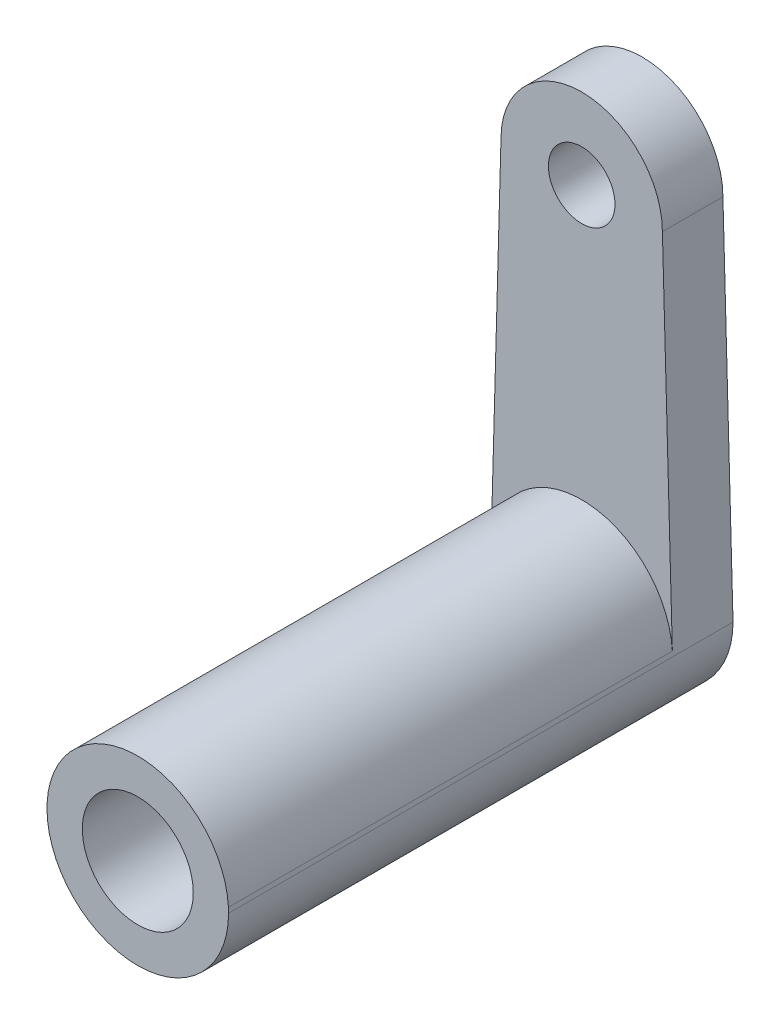
ISO-10303-21;
HEADER;
FILE_DESCRIPTION(('STEP AP214'),'2;1');
FILE_NAME('part.step','',(''),(''),'','','');
FILE_SCHEMA(('AUTOMOTIVE_DESIGN { 1 0 10303 214 1 1 1 1 }'));
ENDSEC;
DATA;
#1=APPLICATION_CONTEXT('core data for automotive mechanical design processes');
#2=APPLICATION_PROTOCOL_DEFINITION('international standard','automotive_design',2000,#1);
#3=PRODUCT_CONTEXT('',#1,'mechanical');
#4=PRODUCT('Part','Part','',(#3));
#5=PRODUCT_RELATED_PRODUCT_CATEGORY('part','',(#4));
#6=PRODUCT_DEFINITION_FORMATION('','',#4);
#7=PRODUCT_DEFINITION_CONTEXT('part definition',#1,'design');
#8=PRODUCT_DEFINITION('design','',#6,#7);
#9=PRODUCT_DEFINITION_SHAPE('','',#8);
#10=(LENGTH_UNIT() NAMED_UNIT(*) SI_UNIT(.MILLI.,.METRE.));
#11=(NAMED_UNIT(*) PLANE_ANGLE_UNIT() SI_UNIT($,.RADIAN.));
#12=(NAMED_UNIT(*) SI_UNIT($,.STERADIAN.) SOLID_ANGLE_UNIT());
#13=UNCERTAINTY_MEASURE_WITH_UNIT(LENGTH_MEASURE(1.E-05),#10,'distance_accuracy_value','');
#14=(GEOMETRIC_REPRESENTATION_CONTEXT(3) GLOBAL_UNCERTAINTY_ASSIGNED_CONTEXT((#13)) GLOBAL_UNIT_ASSIGNED_CONTEXT((#10,
#11,#12)) REPRESENTATION_CONTEXT('',''));
#15=CARTESIAN_POINT('',(0.,0.,0.));
#16=DIRECTION('',(0.,0.,1.));
#17=DIRECTION('',(1.,0.,0.));
#18=AXIS2_PLACEMENT_3D('',#15,#16,#17);
#19=CARTESIAN_POINT('',(0.,2.,3.));
#20=DIRECTION('',(0.,1.,0.));
#21=DIRECTION('',(0.,0.,1.));
#22=AXIS2_PLACEMENT_3D('',#19,#20,#21);
#23=PLANE('',#22);
#24=DIRECTION('',(1.,0.,0.));
#25=VECTOR('',#24,1.);
#26=CARTESIAN_POINT('',(0.,2.,15.));
#27=LINE('',#26,#25);
#28=CARTESIAN_POINT('',(-1.88745860881769,2.,15.));
#29=VERTEX_POINT('',#28);
#30=CARTESIAN_POINT('',(1.88745860881769,2.,15.));
#31=VERTEX_POINT('',#30);
#32=EDGE_CURVE('E11',#29,#31,#27,.T.);
#33=ORIENTED_EDGE('',*,*,#32,.F.);
#34=DIRECTION('',(0.,0.,-1.));
#35=VECTOR('',#34,1.);
#36=CARTESIAN_POINT('',(-1.88745860881769,2.,3.));
#37=LINE('',#36,#35);
#38=CARTESIAN_POINT('',(-1.88745860881769,2.,0.));
#39=VERTEX_POINT('',#38);
#40=EDGE_CURVE('E92',#29,#39,#37,.T.);
#41=ORIENTED_EDGE('',*,*,#40,.T.);
#42=DIRECTION('',(1.,0.,0.));
#43=VECTOR('',#42,1.);
#44=CARTESIAN_POINT('',(0.,2.,0.));
#45=LINE('',#44,#43);
#46=CARTESIAN_POINT('',(1.88745860881769,2.,0.));
#47=VERTEX_POINT('',#46);
#48=EDGE_CURVE('E125',#39,#47,#45,.T.);
#49=ORIENTED_EDGE('',*,*,#48,.T.);
#50=DIRECTION('',(0.,0.,-1.));
#51=VECTOR('',#50,1.);
#52=CARTESIAN_POINT('',(1.88745860881769,2.,3.));
#53=LINE('',#52,#51);
#54=EDGE_CURVE('E117',#31,#47,#53,.T.);
#55=ORIENTED_EDGE('',*,*,#54,.F.);
#56=EDGE_LOOP('',(#33,#41,#49,#55));
#57=FACE_BOUND('',#56,.T.);
#58=ADVANCED_FACE('F41',(#57),#23,.F.);
#59=CARTESIAN_POINT('',(0.,0.,3.));
#60=DIRECTION('',(0.,0.,1.));
#61=DIRECTION('',(1.,0.,0.));
#62=AXIS2_PLACEMENT_3D('',#59,#60,#61);
#63=PLANE('',#62);
#64=CARTESIAN_POINT('',(0.,18.,3.));
#65=DIRECTION('',(0.,0.,1.));
#66=DIRECTION('',(1.,0.,0.));
#67=AXIS2_PLACEMENT_3D('',#64,#65,#66);
#68=CIRCLE('',#67,1.65);
#69=CARTESIAN_POINT('',(1.65,18.,3.));
#70=VERTEX_POINT('',#69);
#71=EDGE_CURVE('E104',#70,#70,#68,.T.);
#72=ORIENTED_EDGE('',*,*,#71,.F.);
#73=EDGE_LOOP('',(#72));
#74=FACE_BOUND('',#73,.T.);
#75=DIRECTION('',(-0.0277670672403533,-0.999614420652718,0.));
#76=VECTOR('',#75,1.);
#77=CARTESIAN_POINT('',(-4.49653045489591,0.124903623747109,3.));
#78=LINE('',#77,#76);
#79=CARTESIAN_POINT('',(-4.,18.,3.));
#80=VERTEX_POINT('',#79);
#81=CARTESIAN_POINT('',(-4.49306090979183,0.249807247494222,3.));
#82=VERTEX_POINT('',#81);
#83=EDGE_CURVE('E196',#80,#82,#78,.T.);
#84=ORIENTED_EDGE('',*,*,#83,.T.);
#85=CARTESIAN_POINT('',(0.,0.,3.));
#86=DIRECTION('',(0.,0.,1.));
#87=DIRECTION('',(1.,0.,0.));
#88=AXIS2_PLACEMENT_3D('',#85,#86,#87);
#89=CIRCLE('',#88,4.5);
#90=CARTESIAN_POINT('',(4.49306090979183,0.249807247494222,3.));
#91=VERTEX_POINT('',#90);
#92=EDGE_CURVE('E135',#82,#91,#89,.F.);
#93=ORIENTED_EDGE('',*,*,#92,.T.);
#94=DIRECTION('',(0.0277670672403533,-0.999614420652718,0.));
#95=VECTOR('',#94,1.);
#96=CARTESIAN_POINT('',(4.49653045489591,0.124903623747109,3.));
#97=LINE('',#96,#95);
#98=CARTESIAN_POINT('',(4.,18.,3.));
#99=VERTEX_POINT('',#98);
#100=EDGE_CURVE('E118',#99,#91,#97,.T.);
#101=ORIENTED_EDGE('',*,*,#100,.F.);
#102=CARTESIAN_POINT('',(0.,18.,3.));
#103=DIRECTION('',(0.,0.,1.));
#104=DIRECTION('',(1.,0.,0.));
#105=AXIS2_PLACEMENT_3D('',#102,#103,#104);
#106=CIRCLE('',#105,4.);
#107=EDGE_CURVE('E89',#99,#80,#106,.T.);
#108=ORIENTED_EDGE('',*,*,#107,.T.);
#109=EDGE_LOOP('',(#84,#93,#101,#108));
#110=FACE_BOUND('',#109,.T.);
#111=ADVANCED_FACE('F198',(#74,#110),#63,.T.);
#112=CARTESIAN_POINT('',(0.,18.,3.));
#113=DIRECTION('',(0.,0.,-1.));
#114=DIRECTION('',(-1.,0.,0.));
#115=AXIS2_PLACEMENT_3D('',#112,#113,#114);
#116=CYLINDRICAL_SURFACE('',#115,4.);
#117=CARTESIAN_POINT('',(0.,18.,0.));
#118=DIRECTION('',(0.,0.,1.));
#119=DIRECTION('',(1.,0.,0.));
#120=AXIS2_PLACEMENT_3D('',#117,#118,#119);
#121=CIRCLE('',#120,4.);
#122=CARTESIAN_POINT('',(4.,18.,0.));
#123=VERTEX_POINT('',#122);
#124=CARTESIAN_POINT('',(-4.,18.,0.));
#125=VERTEX_POINT('',#124);
#126=EDGE_CURVE('E87',#123,#125,#121,.T.);
#127=ORIENTED_EDGE('',*,*,#126,.T.);
#128=DIRECTION('',(0.,0.,-1.));
#129=VECTOR('',#128,1.);
#130=CARTESIAN_POINT('',(-4.,18.,3.));
#131=LINE('',#130,#129);
#132=EDGE_CURVE('E50',#80,#125,#131,.T.);
#133=ORIENTED_EDGE('',*,*,#132,.F.);
#134=ORIENTED_EDGE('',*,*,#107,.F.);
#135=DIRECTION('',(0.,0.,-1.));
#136=VECTOR('',#135,1.);
#137=CARTESIAN_POINT('',(4.,18.,3.));
#138=LINE('',#137,#136);
#139=EDGE_CURVE('E58',#99,#123,#138,.T.);
#140=ORIENTED_EDGE('',*,*,#139,.T.);
#141=EDGE_LOOP('',(#127,#133,#134,#140));
#142=FACE_BOUND('',#141,.T.);
#143=ADVANCED_FACE('F85',(#142),#116,.T.);
#144=CARTESIAN_POINT('',(-4.49653045489591,0.124903623747109,3.));
#145=DIRECTION('',(0.999614420652718,-0.0277670672403533,0.));
#146=DIRECTION('',(0.0277670672403533,0.999614420652718,0.));
#147=AXIS2_PLACEMENT_3D('',#144,#145,#146);
#148=PLANE('',#147);
#149=DIRECTION('',(0.,0.,-1.));
#150=VECTOR('',#149,1.);
#151=CARTESIAN_POINT('',(-4.5,0.,3.));
#152=LINE('',#151,#150);
#153=CARTESIAN_POINT('',(-4.5,0.,25.));
#154=VERTEX_POINT('',#153);
#155=CARTESIAN_POINT('',(-4.5,0.,0.));
#156=VERTEX_POINT('',#155);
#157=EDGE_CURVE('E113',#154,#156,#152,.T.);
#158=ORIENTED_EDGE('',*,*,#157,.F.);
#159=DIRECTION('',(-0.0277670672403533,-0.999614420652718,0.));
#160=VECTOR('',#159,1.);
#161=CARTESIAN_POINT('',(-4.49653045489591,0.124903623747109,25.));
#162=LINE('',#161,#160);
#163=CARTESIAN_POINT('',(-4.49306090979183,0.249807247494222,25.));
#164=VERTEX_POINT('',#163);
#165=EDGE_CURVE('E161',#164,#154,#162,.T.);
#166=ORIENTED_EDGE('',*,*,#165,.F.);
#167=DIRECTION('',(0.,0.,-1.));
#168=VECTOR('',#167,1.);
#169=CARTESIAN_POINT('',(-4.49306090979183,0.249807247494222,25.));
#170=LINE('',#169,#168);
#171=EDGE_CURVE('E138',#164,#82,#170,.T.);
#172=ORIENTED_EDGE('',*,*,#171,.T.);
#173=ORIENTED_EDGE('',*,*,#83,.F.);
#174=ORIENTED_EDGE('',*,*,#132,.T.);
#175=DIRECTION('',(-0.0277670672403533,-0.999614420652718,0.));
#176=VECTOR('',#175,1.);
#177=CARTESIAN_POINT('',(-4.49653045489591,0.124903623747109,0.));
#178=LINE('',#177,#176);
#179=EDGE_CURVE('E96',#125,#156,#178,.T.);
#180=ORIENTED_EDGE('',*,*,#179,.T.);
#181=EDGE_LOOP('',(#158,#166,#172,#173,#174,#180));
#182=FACE_BOUND('',#181,.T.);
#183=ADVANCED_FACE('F146',(#182),#148,.F.);
#184=CARTESIAN_POINT('',(0.,0.,3.));
#185=DIRECTION('',(0.,0.,-1.));
#186=DIRECTION('',(-1.,0.,0.));
#187=AXIS2_PLACEMENT_3D('',#184,#185,#186);
#188=CYLINDRICAL_SURFACE('',#187,4.5);
#189=CARTESIAN_POINT('',(0.,0.,0.));
#190=DIRECTION('',(0.,0.,1.));
#191=DIRECTION('',(1.,0.,0.));
#192=AXIS2_PLACEMENT_3D('',#189,#190,#191);
#193=CIRCLE('',#192,4.5);
#194=CARTESIAN_POINT('',(4.5,0.,0.));
#195=VERTEX_POINT('',#194);
#196=EDGE_CURVE('E105',#156,#195,#193,.T.);
#197=ORIENTED_EDGE('',*,*,#196,.T.);
#198=DIRECTION('',(0.,0.,-1.));
#199=VECTOR('',#198,1.);
#200=CARTESIAN_POINT('',(4.5,0.,3.));
#201=LINE('',#200,#199);
#202=CARTESIAN_POINT('',(4.5,0.,25.));
#203=VERTEX_POINT('',#202);
#204=EDGE_CURVE('E91',#203,#195,#201,.T.);
#205=ORIENTED_EDGE('',*,*,#204,.F.);
#206=CARTESIAN_POINT('',(0.,0.,25.));
#207=DIRECTION('',(0.,0.,1.));
#208=DIRECTION('',(1.,0.,0.));
#209=AXIS2_PLACEMENT_3D('',#206,#207,#208);
#210=CIRCLE('',#209,4.5);
#211=EDGE_CURVE('E154',#154,#203,#210,.T.);
#212=ORIENTED_EDGE('',*,*,#211,.F.);
#213=ORIENTED_EDGE('',*,*,#157,.T.);
#214=EDGE_LOOP('',(#197,#205,#212,#213));
#215=FACE_BOUND('',#214,.T.);
#216=ADVANCED_FACE('F152',(#215),#188,.T.);
#217=CARTESIAN_POINT('',(0.,0.,3.));
#218=DIRECTION('',(0.,0.,-1.));
#219=DIRECTION('',(-1.,0.,0.));
#220=AXIS2_PLACEMENT_3D('',#217,#218,#219);
#221=CYLINDRICAL_SURFACE('',#220,2.75);
#222=CARTESIAN_POINT('',(0.,0.,15.));
#223=DIRECTION('',(0.,0.,1.));
#224=DIRECTION('',(1.,0.,0.));
#225=AXIS2_PLACEMENT_3D('',#222,#223,#224);
#226=CIRCLE('',#225,2.75);
#227=EDGE_CURVE('E173',#31,#29,#226,.T.);
#228=ORIENTED_EDGE('',*,*,#227,.F.);
#229=ORIENTED_EDGE('',*,*,#54,.T.);
#230=CARTESIAN_POINT('',(0.,0.,0.));
#231=DIRECTION('',(0.,0.,1.));
#232=DIRECTION('',(1.,0.,0.));
#233=AXIS2_PLACEMENT_3D('',#230,#231,#232);
#234=CIRCLE('',#233,2.75);
#235=EDGE_CURVE('E132',#39,#47,#234,.T.);
#236=ORIENTED_EDGE('',*,*,#235,.F.);
#237=ORIENTED_EDGE('',*,*,#40,.F.);
#238=EDGE_LOOP('',(#228,#229,#236,#237));
#239=FACE_BOUND('',#238,.T.);
#240=CARTESIAN_POINT('',(0.,0.,25.));
#241=DIRECTION('',(0.,0.,1.));
#242=DIRECTION('',(1.,0.,0.));
#243=AXIS2_PLACEMENT_3D('',#240,#241,#242);
#244=CIRCLE('',#243,2.75);
#245=CARTESIAN_POINT('',(2.75,0.,25.));
#246=VERTEX_POINT('',#245);
#247=EDGE_CURVE('E169',#246,#246,#244,.T.);
#248=ORIENTED_EDGE('',*,*,#247,.T.);
#249=EDGE_LOOP('',(#248));
#250=FACE_BOUND('',#249,.T.);
#251=ADVANCED_FACE('F43',(#239,#250),#221,.F.);
#252=CARTESIAN_POINT('',(0.,18.,3.));
#253=DIRECTION('',(0.,0.,-1.));
#254=DIRECTION('',(-1.,0.,0.));
#255=AXIS2_PLACEMENT_3D('',#252,#253,#254);
#256=CYLINDRICAL_SURFACE('',#255,1.65);
#257=ORIENTED_EDGE('',*,*,#71,.T.);
#258=EDGE_LOOP('',(#257));
#259=FACE_BOUND('',#258,.T.);
#260=CARTESIAN_POINT('',(0.,18.,0.));
#261=DIRECTION('',(0.,0.,1.));
#262=DIRECTION('',(1.,0.,0.));
#263=AXIS2_PLACEMENT_3D('',#260,#261,#262);
#264=CIRCLE('',#263,1.65);
#265=CARTESIAN_POINT('',(1.65,18.,0.));
#266=VERTEX_POINT('',#265);
#267=EDGE_CURVE('E98',#266,#266,#264,.T.);
#268=ORIENTED_EDGE('',*,*,#267,.F.);
#269=EDGE_LOOP('',(#268));
#270=FACE_BOUND('',#269,.T.);
#271=ADVANCED_FACE('F219',(#259,#270),#256,.F.);
#272=CARTESIAN_POINT('',(4.49653045489591,0.124903623747109,3.));
#273=DIRECTION('',(0.999614420652718,0.0277670672403533,0.));
#274=DIRECTION('',(-0.0277670672403533,0.999614420652718,0.));
#275=AXIS2_PLACEMENT_3D('',#272,#273,#274);
#276=PLANE('',#275);
#277=ORIENTED_EDGE('',*,*,#204,.T.);
#278=DIRECTION('',(0.0277670672403533,-0.999614420652718,0.));
#279=VECTOR('',#278,1.);
#280=CARTESIAN_POINT('',(4.49653045489591,0.124903623747109,0.));
#281=LINE('',#280,#279);
#282=EDGE_CURVE('E81',#123,#195,#281,.T.);
#283=ORIENTED_EDGE('',*,*,#282,.F.);
#284=ORIENTED_EDGE('',*,*,#139,.F.);
#285=ORIENTED_EDGE('',*,*,#100,.T.);
#286=DIRECTION('',(0.,0.,-1.));
#287=VECTOR('',#286,1.);
#288=CARTESIAN_POINT('',(4.49306090979183,0.249807247494222,25.));
#289=LINE('',#288,#287);
#290=CARTESIAN_POINT('',(4.49306090979183,0.249807247494222,25.));
#291=VERTEX_POINT('',#290);
#292=EDGE_CURVE('E164',#291,#91,#289,.T.);
#293=ORIENTED_EDGE('',*,*,#292,.F.);
#294=DIRECTION('',(0.0277670672403533,-0.999614420652718,0.));
#295=VECTOR('',#294,1.);
#296=CARTESIAN_POINT('',(4.49653045489591,0.124903623747109,25.));
#297=LINE('',#296,#295);
#298=EDGE_CURVE('E160',#291,#203,#297,.T.);
#299=ORIENTED_EDGE('',*,*,#298,.T.);
#300=EDGE_LOOP('',(#277,#283,#284,#285,#293,#299));
#301=FACE_BOUND('',#300,.T.);
#302=ADVANCED_FACE('F100',(#301),#276,.T.);
#303=CARTESIAN_POINT('',(0.,0.,0.));
#304=DIRECTION('',(0.,0.,1.));
#305=DIRECTION('',(1.,0.,0.));
#306=AXIS2_PLACEMENT_3D('',#303,#304,#305);
#307=PLANE('',#306);
#308=ORIENTED_EDGE('',*,*,#235,.T.);
#309=ORIENTED_EDGE('',*,*,#48,.F.);
#310=EDGE_LOOP('',(#308,#309));
#311=FACE_BOUND('',#310,.T.);
#312=ORIENTED_EDGE('',*,*,#196,.F.);
#313=ORIENTED_EDGE('',*,*,#179,.F.);
#314=ORIENTED_EDGE('',*,*,#126,.F.);
#315=ORIENTED_EDGE('',*,*,#282,.T.);
#316=EDGE_LOOP('',(#312,#313,#314,#315));
#317=FACE_BOUND('',#316,.T.);
#318=ORIENTED_EDGE('',*,*,#267,.T.);
#319=EDGE_LOOP('',(#318));
#320=FACE_BOUND('',#319,.T.);
#321=ADVANCED_FACE('F94',(#311,#317,#320),#307,.F.);
#322=CARTESIAN_POINT('',(0.,0.,25.));
#323=DIRECTION('',(0.,0.,-1.));
#324=DIRECTION('',(-1.,0.,0.));
#325=AXIS2_PLACEMENT_3D('',#322,#323,#324);
#326=CYLINDRICAL_SURFACE('',#325,4.5);
#327=ORIENTED_EDGE('',*,*,#92,.F.);
#328=ORIENTED_EDGE('',*,*,#171,.F.);
#329=EDGE_CURVE('E163',#291,#164,#210,.T.);
#330=ORIENTED_EDGE('',*,*,#329,.F.);
#331=ORIENTED_EDGE('',*,*,#292,.T.);
#332=EDGE_LOOP('',(#327,#328,#330,#331));
#333=FACE_BOUND('',#332,.T.);
#334=ADVANCED_FACE('F193',(#333),#326,.T.);
#335=CARTESIAN_POINT('',(0.,0.,25.));
#336=DIRECTION('',(0.,0.,1.));
#337=DIRECTION('',(1.,0.,0.));
#338=AXIS2_PLACEMENT_3D('',#335,#336,#337);
#339=PLANE('',#338);
#340=ORIENTED_EDGE('',*,*,#247,.F.);
#341=EDGE_LOOP('',(#340));
#342=FACE_BOUND('',#341,.T.);
#343=ORIENTED_EDGE('',*,*,#329,.T.);
#344=ORIENTED_EDGE('',*,*,#165,.T.);
#345=ORIENTED_EDGE('',*,*,#211,.T.);
#346=ORIENTED_EDGE('',*,*,#298,.F.);
#347=EDGE_LOOP('',(#343,#344,#345,#346));
#348=FACE_BOUND('',#347,.T.);
#349=ADVANCED_FACE('F201',(#342,#348),#339,.T.);
#350=CARTESIAN_POINT('',(0.,0.,15.));
#351=DIRECTION('',(0.,0.,1.));
#352=DIRECTION('',(1.,0.,0.));
#353=AXIS2_PLACEMENT_3D('',#350,#351,#352);
#354=PLANE('',#353);
#355=ORIENTED_EDGE('',*,*,#32,.T.);
#356=ORIENTED_EDGE('',*,*,#227,.T.);
#357=EDGE_LOOP('',(#355,#356));
#358=FACE_BOUND('',#357,.T.);
#359=ADVANCED_FACE('F178',(#358),#354,.T.);
#360=CLOSED_SHELL('',(#58,#111,#143,#183,#216,#251,#271,#302,#321,#334,#349,#359));
#361=MANIFOLD_SOLID_BREP('B2',#360);
#362=ADVANCED_BREP_SHAPE_REPRESENTATION('',(#18,#361),#14);
#363=SHAPE_DEFINITION_REPRESENTATION(#9,#362);
ENDSEC;
END-ISO-10303-21;
